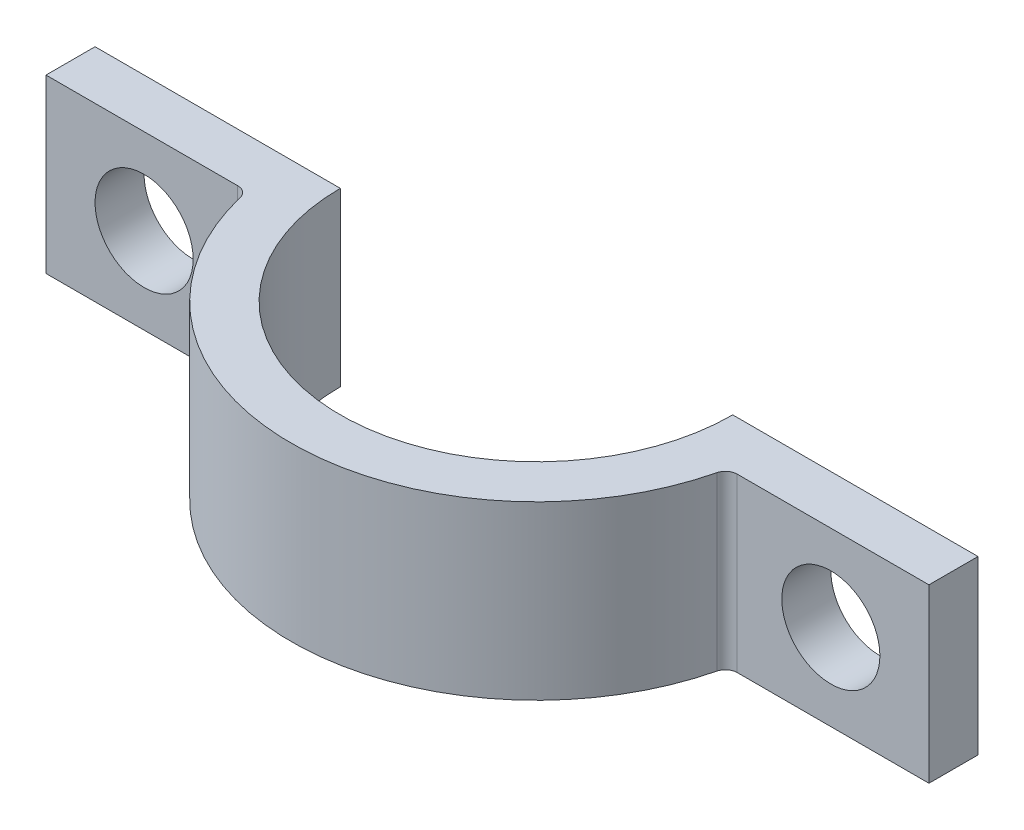
ISO-10303-21;
HEADER;
FILE_DESCRIPTION(('STEP AP214'),'2;1');
FILE_NAME('part.step','',(''),(''),'','','');
FILE_SCHEMA(('AUTOMOTIVE_DESIGN { 1 0 10303 214 1 1 1 1 }'));
ENDSEC;
DATA;
#1=APPLICATION_CONTEXT('core data for automotive mechanical design processes');
#2=APPLICATION_PROTOCOL_DEFINITION('international standard','automotive_design',2000,#1);
#3=PRODUCT_CONTEXT('',#1,'mechanical');
#4=PRODUCT('Part','Part','',(#3));
#5=PRODUCT_RELATED_PRODUCT_CATEGORY('part','',(#4));
#6=PRODUCT_DEFINITION_FORMATION('','',#4);
#7=PRODUCT_DEFINITION_CONTEXT('part definition',#1,'design');
#8=PRODUCT_DEFINITION('design','',#6,#7);
#9=PRODUCT_DEFINITION_SHAPE('','',#8);
#10=(LENGTH_UNIT() NAMED_UNIT(*) SI_UNIT(.MILLI.,.METRE.));
#11=(NAMED_UNIT(*) PLANE_ANGLE_UNIT() SI_UNIT($,.RADIAN.));
#12=(NAMED_UNIT(*) SI_UNIT($,.STERADIAN.) SOLID_ANGLE_UNIT());
#13=UNCERTAINTY_MEASURE_WITH_UNIT(LENGTH_MEASURE(1.E-05),#10,'distance_accuracy_value','');
#14=(GEOMETRIC_REPRESENTATION_CONTEXT(3) GLOBAL_UNCERTAINTY_ASSIGNED_CONTEXT((#13)) GLOBAL_UNIT_ASSIGNED_CONTEXT((#10,
#11,#12)) REPRESENTATION_CONTEXT('',''));
#15=CARTESIAN_POINT('',(0.,0.,0.));
#16=DIRECTION('',(0.,0.,1.));
#17=DIRECTION('',(1.,0.,0.));
#18=AXIS2_PLACEMENT_3D('',#15,#16,#17);
#19=CARTESIAN_POINT('',(0.,5.5626,0.));
#20=DIRECTION('',(0.,-1.,0.));
#21=DIRECTION('',(0.,0.,-1.));
#22=AXIS2_PLACEMENT_3D('',#19,#20,#21);
#23=CYLINDRICAL_SURFACE('',#22,12.7);
#24=CARTESIAN_POINT('',(0.,-5.5626,0.));
#25=DIRECTION('',(0.,-1.,0.));
#26=DIRECTION('',(0.,0.,1.));
#27=AXIS2_PLACEMENT_3D('',#24,#25,#26);
#28=CIRCLE('',#27,12.7);
#29=CARTESIAN_POINT('',(12.7,-5.5626,0.));
#30=VERTEX_POINT('',#29);
#31=CARTESIAN_POINT('',(-12.7,-5.5626,0.));
#32=VERTEX_POINT('',#31);
#33=EDGE_CURVE('E149',#30,#32,#28,.T.);
#34=ORIENTED_EDGE('',*,*,#33,.T.);
#35=DIRECTION('',(0.,-1.,0.));
#36=VECTOR('',#35,1.);
#37=CARTESIAN_POINT('',(-12.7,5.5626,0.));
#38=LINE('',#37,#36);
#39=CARTESIAN_POINT('',(-12.7,5.5626,0.));
#40=VERTEX_POINT('',#39);
#41=EDGE_CURVE('E12',#40,#32,#38,.T.);
#42=ORIENTED_EDGE('',*,*,#41,.F.);
#43=CARTESIAN_POINT('',(0.,5.5626,0.));
#44=DIRECTION('',(0.,-1.,0.));
#45=DIRECTION('',(0.,0.,1.));
#46=AXIS2_PLACEMENT_3D('',#43,#44,#45);
#47=CIRCLE('',#46,12.7);
#48=CARTESIAN_POINT('',(12.7,5.5626,0.));
#49=VERTEX_POINT('',#48);
#50=EDGE_CURVE('E164',#49,#40,#47,.T.);
#51=ORIENTED_EDGE('',*,*,#50,.F.);
#52=DIRECTION('',(0.,-1.,0.));
#53=VECTOR('',#52,1.);
#54=CARTESIAN_POINT('',(12.7,5.5626,0.));
#55=LINE('',#54,#53);
#56=EDGE_CURVE('E145',#49,#30,#55,.T.);
#57=ORIENTED_EDGE('',*,*,#56,.T.);
#58=EDGE_LOOP('',(#34,#42,#51,#57));
#59=FACE_BOUND('',#58,.T.);
#60=ADVANCED_FACE('F41',(#59),#23,.F.);
#61=CARTESIAN_POINT('',(-12.7,5.5626,0.));
#62=DIRECTION('',(0.,0.,1.));
#63=DIRECTION('',(1.,0.,0.));
#64=AXIS2_PLACEMENT_3D('',#61,#62,#63);
#65=PLANE('',#64);
#66=CARTESIAN_POINT('',(-22.225,0.,0.));
#67=DIRECTION('',(0.,0.,1.));
#68=DIRECTION('',(1.,0.,0.));
#69=AXIS2_PLACEMENT_3D('',#66,#67,#68);
#70=CIRCLE('',#69,3.175);
#71=CARTESIAN_POINT('',(-19.05,0.,0.));
#72=VERTEX_POINT('',#71);
#73=EDGE_CURVE('E153',#72,#72,#70,.T.);
#74=ORIENTED_EDGE('',*,*,#73,.T.);
#75=EDGE_LOOP('',(#74));
#76=FACE_BOUND('',#75,.T.);
#77=DIRECTION('',(-1.,0.,0.));
#78=VECTOR('',#77,1.);
#79=CARTESIAN_POINT('',(-12.7,-5.5626,0.));
#80=LINE('',#79,#78);
#81=CARTESIAN_POINT('',(-28.575,-5.5626,0.));
#82=VERTEX_POINT('',#81);
#83=EDGE_CURVE('E152',#32,#82,#80,.T.);
#84=ORIENTED_EDGE('',*,*,#83,.T.);
#85=DIRECTION('',(0.,-1.,0.));
#86=VECTOR('',#85,1.);
#87=CARTESIAN_POINT('',(-28.575,5.5626,0.));
#88=LINE('',#87,#86);
#89=CARTESIAN_POINT('',(-28.575,5.5626,0.));
#90=VERTEX_POINT('',#89);
#91=EDGE_CURVE('E49',#90,#82,#88,.T.);
#92=ORIENTED_EDGE('',*,*,#91,.F.);
#93=DIRECTION('',(-1.,0.,0.));
#94=VECTOR('',#93,1.);
#95=CARTESIAN_POINT('',(-12.7,5.5626,0.));
#96=LINE('',#95,#94);
#97=EDGE_CURVE('E106',#40,#90,#96,.T.);
#98=ORIENTED_EDGE('',*,*,#97,.F.);
#99=ORIENTED_EDGE('',*,*,#41,.T.);
#100=EDGE_LOOP('',(#84,#92,#98,#99));
#101=FACE_BOUND('',#100,.T.);
#102=ADVANCED_FACE('F233',(#76,#101),#65,.F.);
#103=CARTESIAN_POINT('',(-28.575,5.5626,0.));
#104=DIRECTION('',(1.,0.,0.));
#105=DIRECTION('',(0.,0.,-1.));
#106=AXIS2_PLACEMENT_3D('',#103,#104,#105);
#107=PLANE('',#106);
#108=DIRECTION('',(0.,0.,1.));
#109=VECTOR('',#108,1.);
#110=CARTESIAN_POINT('',(-28.575,-5.5626,0.));
#111=LINE('',#110,#109);
#112=CARTESIAN_POINT('',(-28.575,-5.5626,3.175));
#113=VERTEX_POINT('',#112);
#114=EDGE_CURVE('E187',#82,#113,#111,.T.);
#115=ORIENTED_EDGE('',*,*,#114,.T.);
#116=DIRECTION('',(0.,-1.,0.));
#117=VECTOR('',#116,1.);
#118=CARTESIAN_POINT('',(-28.575,5.5626,3.175));
#119=LINE('',#118,#117);
#120=CARTESIAN_POINT('',(-28.575,5.5626,3.175));
#121=VERTEX_POINT('',#120);
#122=EDGE_CURVE('E179',#121,#113,#119,.T.);
#123=ORIENTED_EDGE('',*,*,#122,.F.);
#124=DIRECTION('',(0.,0.,1.));
#125=VECTOR('',#124,1.);
#126=CARTESIAN_POINT('',(-28.575,5.5626,0.));
#127=LINE('',#126,#125);
#128=EDGE_CURVE('E188',#90,#121,#127,.T.);
#129=ORIENTED_EDGE('',*,*,#128,.F.);
#130=ORIENTED_EDGE('',*,*,#91,.T.);
#131=EDGE_LOOP('',(#115,#123,#129,#130));
#132=FACE_BOUND('',#131,.T.);
#133=ADVANCED_FACE('F185',(#132),#107,.F.);
#134=CARTESIAN_POINT('',(-28.575,5.5626,3.175));
#135=DIRECTION('',(0.,0.,-1.));
#136=DIRECTION('',(-1.,0.,0.));
#137=AXIS2_PLACEMENT_3D('',#134,#135,#136);
#138=PLANE('',#137);
#139=CARTESIAN_POINT('',(-22.225,0.,3.17500000000002));
#140=DIRECTION('',(0.,0.,1.));
#141=DIRECTION('',(1.,0.,0.));
#142=AXIS2_PLACEMENT_3D('',#139,#140,#141);
#143=CIRCLE('',#142,3.175);
#144=CARTESIAN_POINT('',(-19.05,0.,3.17500000000002));
#145=VERTEX_POINT('',#144);
#146=EDGE_CURVE('E268',#145,#145,#143,.T.);
#147=ORIENTED_EDGE('',*,*,#146,.F.);
#148=EDGE_LOOP('',(#147));
#149=FACE_BOUND('',#148,.T.);
#150=DIRECTION('',(1.,0.,0.));
#151=VECTOR('',#150,1.);
#152=CARTESIAN_POINT('',(-28.575,-5.5626,3.175));
#153=LINE('',#152,#151);
#154=CARTESIAN_POINT('',(-16.1644610179245,-5.5626,3.17500000000001));
#155=VERTEX_POINT('',#154);
#156=EDGE_CURVE('E194',#113,#155,#153,.T.);
#157=ORIENTED_EDGE('',*,*,#156,.T.);
#158=DIRECTION('',(0.,-1.,0.));
#159=VECTOR('',#158,1.);
#160=CARTESIAN_POINT('',(-16.1644610179245,5.5626,3.17500000000001));
#161=LINE('',#160,#159);
#162=CARTESIAN_POINT('',(-16.1644610179245,5.5626,3.17500000000001));
#163=VERTEX_POINT('',#162);
#164=EDGE_CURVE('E176',#163,#155,#161,.T.);
#165=ORIENTED_EDGE('',*,*,#164,.F.);
#166=DIRECTION('',(1.,0.,0.));
#167=VECTOR('',#166,1.);
#168=CARTESIAN_POINT('',(-28.575,5.5626,3.175));
#169=LINE('',#168,#167);
#170=EDGE_CURVE('E275',#121,#163,#169,.T.);
#171=ORIENTED_EDGE('',*,*,#170,.F.);
#172=ORIENTED_EDGE('',*,*,#122,.T.);
#173=EDGE_LOOP('',(#157,#165,#171,#172));
#174=FACE_BOUND('',#173,.T.);
#175=ADVANCED_FACE('F241',(#149,#174),#138,.F.);
#176=CARTESIAN_POINT('',(-16.1644610179245,5.5626,3.93700000000001));
#177=DIRECTION('',(0.,-1.,0.));
#178=DIRECTION('',(0.,0.,-1.));
#179=AXIS2_PLACEMENT_3D('',#176,#177,#178);
#180=CYLINDRICAL_SURFACE('',#179,0.761999999999999);
#181=CARTESIAN_POINT('',(-16.1644610179245,-5.5626,3.93700000000001));
#182=DIRECTION('',(0.,-1.,0.));
#183=DIRECTION('',(0.,0.,1.));
#184=AXIS2_PLACEMENT_3D('',#181,#182,#183);
#185=CIRCLE('',#184,0.761999999999999);
#186=CARTESIAN_POINT('',(-15.4241040247371,-5.5626,3.75667938931299));
#187=VERTEX_POINT('',#186);
#188=EDGE_CURVE('E195',#155,#187,#185,.T.);
#189=ORIENTED_EDGE('',*,*,#188,.T.);
#190=DIRECTION('',(0.,-1.,0.));
#191=VECTOR('',#190,1.);
#192=CARTESIAN_POINT('',(-15.4241040247371,5.5626,3.75667938931299));
#193=LINE('',#192,#191);
#194=CARTESIAN_POINT('',(-15.4241040247371,5.5626,3.75667938931299));
#195=VERTEX_POINT('',#194);
#196=EDGE_CURVE('E173',#195,#187,#193,.T.);
#197=ORIENTED_EDGE('',*,*,#196,.F.);
#198=CARTESIAN_POINT('',(-16.1644610179245,5.5626,3.93700000000001));
#199=DIRECTION('',(0.,-1.,0.));
#200=DIRECTION('',(0.,0.,1.));
#201=AXIS2_PLACEMENT_3D('',#198,#199,#200);
#202=CIRCLE('',#201,0.761999999999999);
#203=EDGE_CURVE('E277',#163,#195,#202,.T.);
#204=ORIENTED_EDGE('',*,*,#203,.F.);
#205=ORIENTED_EDGE('',*,*,#164,.T.);
#206=EDGE_LOOP('',(#189,#197,#204,#205));
#207=FACE_BOUND('',#206,.T.);
#208=ADVANCED_FACE('F247',(#207),#180,.F.);
#209=CARTESIAN_POINT('',(0.,5.5626,0.));
#210=DIRECTION('',(0.,-1.,0.));
#211=DIRECTION('',(0.,0.,-1.));
#212=AXIS2_PLACEMENT_3D('',#209,#210,#211);
#213=CYLINDRICAL_SURFACE('',#212,15.875);
#214=CARTESIAN_POINT('',(0.,-5.5626,0.));
#215=DIRECTION('',(0.,1.,0.));
#216=DIRECTION('',(0.,0.,1.));
#217=AXIS2_PLACEMENT_3D('',#214,#215,#216);
#218=CIRCLE('',#217,15.875);
#219=CARTESIAN_POINT('',(15.4241040247371,-5.5626,3.75667938931298));
#220=VERTEX_POINT('',#219);
#221=EDGE_CURVE('E206',#187,#220,#218,.T.);
#222=ORIENTED_EDGE('',*,*,#221,.T.);
#223=DIRECTION('',(0.,-1.,0.));
#224=VECTOR('',#223,1.);
#225=CARTESIAN_POINT('',(15.4241040247371,5.5626,3.75667938931298));
#226=LINE('',#225,#224);
#227=CARTESIAN_POINT('',(15.4241040247371,5.5626,3.75667938931298));
#228=VERTEX_POINT('',#227);
#229=EDGE_CURVE('E170',#228,#220,#226,.T.);
#230=ORIENTED_EDGE('',*,*,#229,.F.);
#231=CARTESIAN_POINT('',(0.,5.5626,0.));
#232=DIRECTION('',(0.,1.,0.));
#233=DIRECTION('',(0.,0.,1.));
#234=AXIS2_PLACEMENT_3D('',#231,#232,#233);
#235=CIRCLE('',#234,15.875);
#236=EDGE_CURVE('E279',#195,#228,#235,.T.);
#237=ORIENTED_EDGE('',*,*,#236,.F.);
#238=ORIENTED_EDGE('',*,*,#196,.T.);
#239=EDGE_LOOP('',(#222,#230,#237,#238));
#240=FACE_BOUND('',#239,.T.);
#241=ADVANCED_FACE('F251',(#240),#213,.T.);
#242=CARTESIAN_POINT('',(16.1644610179245,5.5626,3.93700000000001));
#243=DIRECTION('',(0.,-1.,0.));
#244=DIRECTION('',(0.,0.,-1.));
#245=AXIS2_PLACEMENT_3D('',#242,#243,#244);
#246=CYLINDRICAL_SURFACE('',#245,0.761999999999999);
#247=CARTESIAN_POINT('',(16.1644610179245,-5.5626,3.93700000000001));
#248=DIRECTION('',(0.,-1.,0.));
#249=DIRECTION('',(0.,0.,-1.));
#250=AXIS2_PLACEMENT_3D('',#247,#248,#249);
#251=CIRCLE('',#250,0.761999999999999);
#252=CARTESIAN_POINT('',(16.1644610179245,-5.5626,3.17500000000001));
#253=VERTEX_POINT('',#252);
#254=EDGE_CURVE('E209',#220,#253,#251,.T.);
#255=ORIENTED_EDGE('',*,*,#254,.T.);
#256=DIRECTION('',(0.,-1.,0.));
#257=VECTOR('',#256,1.);
#258=CARTESIAN_POINT('',(16.1644610179245,5.5626,3.17500000000001));
#259=LINE('',#258,#257);
#260=CARTESIAN_POINT('',(16.1644610179245,5.5626,3.17500000000001));
#261=VERTEX_POINT('',#260);
#262=EDGE_CURVE('E140',#261,#253,#259,.T.);
#263=ORIENTED_EDGE('',*,*,#262,.F.);
#264=CARTESIAN_POINT('',(16.1644610179245,5.5626,3.93700000000001));
#265=DIRECTION('',(0.,-1.,0.));
#266=DIRECTION('',(0.,0.,-1.));
#267=AXIS2_PLACEMENT_3D('',#264,#265,#266);
#268=CIRCLE('',#267,0.761999999999999);
#269=EDGE_CURVE('E131',#228,#261,#268,.T.);
#270=ORIENTED_EDGE('',*,*,#269,.F.);
#271=ORIENTED_EDGE('',*,*,#229,.T.);
#272=EDGE_LOOP('',(#255,#263,#270,#271));
#273=FACE_BOUND('',#272,.T.);
#274=ADVANCED_FACE('F214',(#273),#246,.F.);
#275=CARTESIAN_POINT('',(28.575,5.5626,3.175));
#276=DIRECTION('',(0.,0.,-1.));
#277=DIRECTION('',(-1.,0.,0.));
#278=AXIS2_PLACEMENT_3D('',#275,#276,#277);
#279=PLANE('',#278);
#280=CARTESIAN_POINT('',(22.225,0.,3.17500000000002));
#281=DIRECTION('',(0.,0.,1.));
#282=DIRECTION('',(1.,0.,0.));
#283=AXIS2_PLACEMENT_3D('',#280,#281,#282);
#284=CIRCLE('',#283,3.175);
#285=CARTESIAN_POINT('',(25.4,0.,3.17500000000002));
#286=VERTEX_POINT('',#285);
#287=EDGE_CURVE('E264',#286,#286,#284,.T.);
#288=ORIENTED_EDGE('',*,*,#287,.F.);
#289=EDGE_LOOP('',(#288));
#290=FACE_BOUND('',#289,.T.);
#291=DIRECTION('',(1.,0.,0.));
#292=VECTOR('',#291,1.);
#293=CARTESIAN_POINT('',(28.575,-5.5626,3.175));
#294=LINE('',#293,#292);
#295=CARTESIAN_POINT('',(28.575,-5.5626,3.175));
#296=VERTEX_POINT('',#295);
#297=EDGE_CURVE('E139',#253,#296,#294,.T.);
#298=ORIENTED_EDGE('',*,*,#297,.T.);
#299=DIRECTION('',(0.,-1.,0.));
#300=VECTOR('',#299,1.);
#301=CARTESIAN_POINT('',(28.575,5.5626,3.175));
#302=LINE('',#301,#300);
#303=CARTESIAN_POINT('',(28.575,5.5626,3.175));
#304=VERTEX_POINT('',#303);
#305=EDGE_CURVE('E136',#304,#296,#302,.T.);
#306=ORIENTED_EDGE('',*,*,#305,.F.);
#307=DIRECTION('',(1.,0.,0.));
#308=VECTOR('',#307,1.);
#309=CARTESIAN_POINT('',(28.575,5.5626,3.175));
#310=LINE('',#309,#308);
#311=EDGE_CURVE('E125',#261,#304,#310,.T.);
#312=ORIENTED_EDGE('',*,*,#311,.F.);
#313=ORIENTED_EDGE('',*,*,#262,.T.);
#314=EDGE_LOOP('',(#298,#306,#312,#313));
#315=FACE_BOUND('',#314,.T.);
#316=ADVANCED_FACE('F137',(#290,#315),#279,.F.);
#317=CARTESIAN_POINT('',(28.575,5.5626,0.));
#318=DIRECTION('',(-1.,0.,0.));
#319=DIRECTION('',(0.,0.,1.));
#320=AXIS2_PLACEMENT_3D('',#317,#318,#319);
#321=PLANE('',#320);
#322=DIRECTION('',(0.,0.,-1.));
#323=VECTOR('',#322,1.);
#324=CARTESIAN_POINT('',(28.575,-5.5626,0.));
#325=LINE('',#324,#323);
#326=CARTESIAN_POINT('',(28.575,-5.5626,0.));
#327=VERTEX_POINT('',#326);
#328=EDGE_CURVE('E92',#296,#327,#325,.T.);
#329=ORIENTED_EDGE('',*,*,#328,.T.);
#330=DIRECTION('',(0.,-1.,0.));
#331=VECTOR('',#330,1.);
#332=CARTESIAN_POINT('',(28.575,5.5626,0.));
#333=LINE('',#332,#331);
#334=CARTESIAN_POINT('',(28.575,5.5626,0.));
#335=VERTEX_POINT('',#334);
#336=EDGE_CURVE('E141',#335,#327,#333,.T.);
#337=ORIENTED_EDGE('',*,*,#336,.F.);
#338=DIRECTION('',(0.,0.,-1.));
#339=VECTOR('',#338,1.);
#340=CARTESIAN_POINT('',(28.575,5.5626,0.));
#341=LINE('',#340,#339);
#342=EDGE_CURVE('E129',#304,#335,#341,.T.);
#343=ORIENTED_EDGE('',*,*,#342,.F.);
#344=ORIENTED_EDGE('',*,*,#305,.T.);
#345=EDGE_LOOP('',(#329,#337,#343,#344));
#346=FACE_BOUND('',#345,.T.);
#347=ADVANCED_FACE('F143',(#346),#321,.F.);
#348=CARTESIAN_POINT('',(12.7,5.5626,0.));
#349=DIRECTION('',(0.,0.,1.));
#350=DIRECTION('',(1.,0.,0.));
#351=AXIS2_PLACEMENT_3D('',#348,#349,#350);
#352=PLANE('',#351);
#353=CARTESIAN_POINT('',(22.225,0.,0.));
#354=DIRECTION('',(0.,0.,1.));
#355=DIRECTION('',(1.,0.,0.));
#356=AXIS2_PLACEMENT_3D('',#353,#354,#355);
#357=CIRCLE('',#356,3.175);
#358=CARTESIAN_POINT('',(25.4,0.,0.));
#359=VERTEX_POINT('',#358);
#360=EDGE_CURVE('E266',#359,#359,#357,.T.);
#361=ORIENTED_EDGE('',*,*,#360,.T.);
#362=EDGE_LOOP('',(#361));
#363=FACE_BOUND('',#362,.T.);
#364=DIRECTION('',(-1.,0.,0.));
#365=VECTOR('',#364,1.);
#366=CARTESIAN_POINT('',(12.7,-5.5626,0.));
#367=LINE('',#366,#365);
#368=EDGE_CURVE('E98',#327,#30,#367,.T.);
#369=ORIENTED_EDGE('',*,*,#368,.T.);
#370=ORIENTED_EDGE('',*,*,#56,.F.);
#371=DIRECTION('',(-1.,0.,0.));
#372=VECTOR('',#371,1.);
#373=CARTESIAN_POINT('',(12.7,5.5626,0.));
#374=LINE('',#373,#372);
#375=EDGE_CURVE('E57',#335,#49,#374,.T.);
#376=ORIENTED_EDGE('',*,*,#375,.F.);
#377=ORIENTED_EDGE('',*,*,#336,.T.);
#378=EDGE_LOOP('',(#369,#370,#376,#377));
#379=FACE_BOUND('',#378,.T.);
#380=ADVANCED_FACE('F220',(#363,#379),#352,.F.);
#381=CARTESIAN_POINT('',(0.,5.5626,0.));
#382=DIRECTION('',(0.,1.,0.));
#383=DIRECTION('',(0.,0.,1.));
#384=AXIS2_PLACEMENT_3D('',#381,#382,#383);
#385=PLANE('',#384);
#386=ORIENTED_EDGE('',*,*,#50,.T.);
#387=ORIENTED_EDGE('',*,*,#97,.T.);
#388=ORIENTED_EDGE('',*,*,#128,.T.);
#389=ORIENTED_EDGE('',*,*,#170,.T.);
#390=ORIENTED_EDGE('',*,*,#203,.T.);
#391=ORIENTED_EDGE('',*,*,#236,.T.);
#392=ORIENTED_EDGE('',*,*,#269,.T.);
#393=ORIENTED_EDGE('',*,*,#311,.T.);
#394=ORIENTED_EDGE('',*,*,#342,.T.);
#395=ORIENTED_EDGE('',*,*,#375,.T.);
#396=EDGE_LOOP('',(#386,#387,#388,#389,#390,#391,#392,#393,#394,#395));
#397=FACE_BOUND('',#396,.T.);
#398=ADVANCED_FACE('F127',(#397),#385,.T.);
#399=CARTESIAN_POINT('',(0.,-5.5626,0.));
#400=DIRECTION('',(0.,1.,0.));
#401=DIRECTION('',(0.,0.,1.));
#402=AXIS2_PLACEMENT_3D('',#399,#400,#401);
#403=PLANE('',#402);
#404=ORIENTED_EDGE('',*,*,#33,.F.);
#405=ORIENTED_EDGE('',*,*,#368,.F.);
#406=ORIENTED_EDGE('',*,*,#328,.F.);
#407=ORIENTED_EDGE('',*,*,#297,.F.);
#408=ORIENTED_EDGE('',*,*,#254,.F.);
#409=ORIENTED_EDGE('',*,*,#221,.F.);
#410=ORIENTED_EDGE('',*,*,#188,.F.);
#411=ORIENTED_EDGE('',*,*,#156,.F.);
#412=ORIENTED_EDGE('',*,*,#114,.F.);
#413=ORIENTED_EDGE('',*,*,#83,.F.);
#414=EDGE_LOOP('',(#404,#405,#406,#407,#408,#409,#410,#411,#412,#413));
#415=FACE_BOUND('',#414,.T.);
#416=ADVANCED_FACE('F192',(#415),#403,.F.);
#417=CARTESIAN_POINT('',(22.225,0.,0.));
#418=DIRECTION('',(0.,0.,1.));
#419=DIRECTION('',(1.,0.,0.));
#420=AXIS2_PLACEMENT_3D('',#417,#418,#419);
#421=CYLINDRICAL_SURFACE('',#420,3.175);
#422=ORIENTED_EDGE('',*,*,#360,.F.);
#423=EDGE_LOOP('',(#422));
#424=FACE_BOUND('',#423,.T.);
#425=ORIENTED_EDGE('',*,*,#287,.T.);
#426=EDGE_LOOP('',(#425));
#427=FACE_BOUND('',#426,.T.);
#428=ADVANCED_FACE('F293',(#424,#427),#421,.F.);
#429=CARTESIAN_POINT('',(-22.225,0.,0.));
#430=DIRECTION('',(0.,0.,1.));
#431=DIRECTION('',(1.,0.,0.));
#432=AXIS2_PLACEMENT_3D('',#429,#430,#431);
#433=CYLINDRICAL_SURFACE('',#432,3.175);
#434=ORIENTED_EDGE('',*,*,#73,.F.);
#435=EDGE_LOOP('',(#434));
#436=FACE_BOUND('',#435,.T.);
#437=ORIENTED_EDGE('',*,*,#146,.T.);
#438=EDGE_LOOP('',(#437));
#439=FACE_BOUND('',#438,.T.);
#440=ADVANCED_FACE('F290',(#436,#439),#433,.F.);
#441=CLOSED_SHELL('',(#60,#102,#133,#175,#208,#241,#274,#316,#347,#380,#398,#416,#428,#440));
#442=MANIFOLD_SOLID_BREP('B2',#441);
#443=ADVANCED_BREP_SHAPE_REPRESENTATION('',(#18,#442),#14);
#444=SHAPE_DEFINITION_REPRESENTATION(#9,#443);
ENDSEC;
END-ISO-10303-21;
